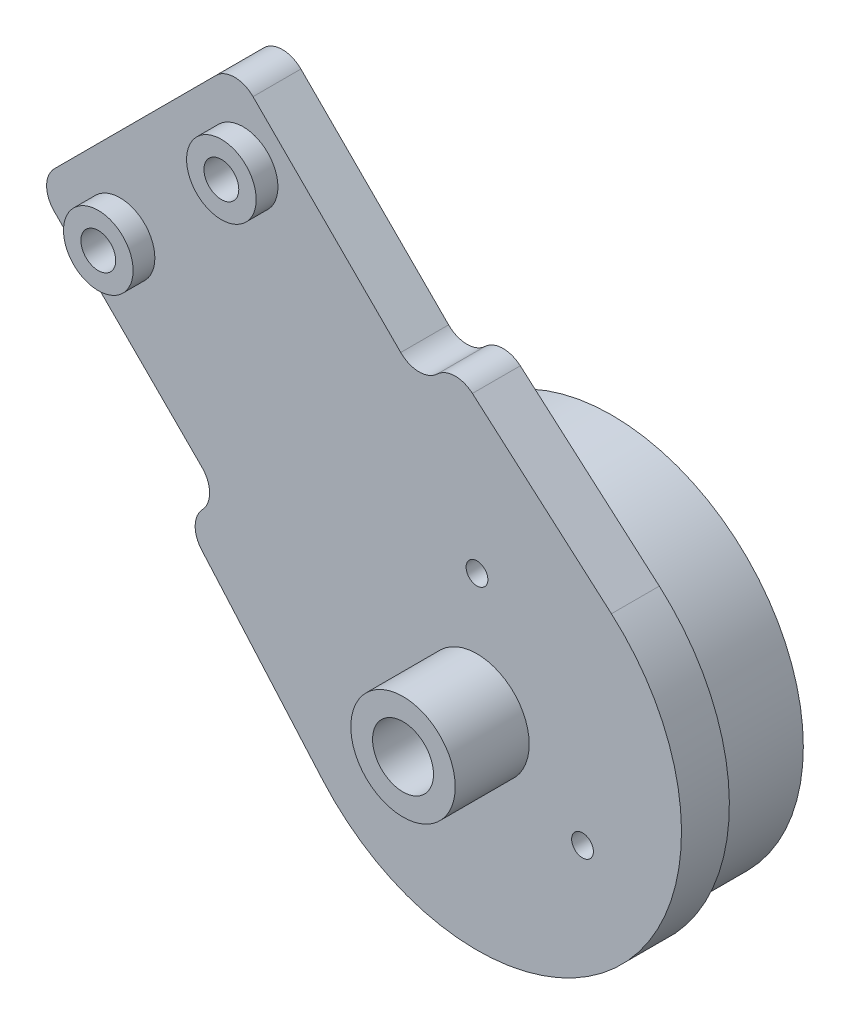
ISO-10303-21;
HEADER;
FILE_DESCRIPTION(('STEP AP214'),'2;1');
FILE_NAME('part.step','',(''),(''),'','','');
FILE_SCHEMA(('AUTOMOTIVE_DESIGN { 1 0 10303 214 1 1 1 1 }'));
ENDSEC;
DATA;
#1=APPLICATION_CONTEXT('core data for automotive mechanical design processes');
#2=APPLICATION_PROTOCOL_DEFINITION('international standard','automotive_design',2000,#1);
#3=PRODUCT_CONTEXT('',#1,'mechanical');
#4=PRODUCT('Part','Part','',(#3));
#5=PRODUCT_RELATED_PRODUCT_CATEGORY('part','',(#4));
#6=PRODUCT_DEFINITION_FORMATION('','',#4);
#7=PRODUCT_DEFINITION_CONTEXT('part definition',#1,'design');
#8=PRODUCT_DEFINITION('design','',#6,#7);
#9=PRODUCT_DEFINITION_SHAPE('','',#8);
#10=(LENGTH_UNIT() NAMED_UNIT(*) SI_UNIT(.MILLI.,.METRE.));
#11=(NAMED_UNIT(*) PLANE_ANGLE_UNIT() SI_UNIT($,.RADIAN.));
#12=(NAMED_UNIT(*) SI_UNIT($,.STERADIAN.) SOLID_ANGLE_UNIT());
#13=UNCERTAINTY_MEASURE_WITH_UNIT(LENGTH_MEASURE(1.E-05),#10,'distance_accuracy_value','');
#14=(GEOMETRIC_REPRESENTATION_CONTEXT(3) GLOBAL_UNCERTAINTY_ASSIGNED_CONTEXT((#13)) GLOBAL_UNIT_ASSIGNED_CONTEXT((#10,
#11,#12)) REPRESENTATION_CONTEXT('',''));
#15=CARTESIAN_POINT('',(0.,0.,0.));
#16=DIRECTION('',(0.,0.,1.));
#17=DIRECTION('',(1.,0.,0.));
#18=AXIS2_PLACEMENT_3D('',#15,#16,#17);
#19=CARTESIAN_POINT('',(93.9692760704438,0.,2.75));
#20=DIRECTION('',(0.,0.,1.));
#21=DIRECTION('',(1.,0.,0.));
#22=AXIS2_PLACEMENT_3D('',#19,#20,#21);
#23=PLANE('',#22);
#24=CARTESIAN_POINT('',(93.9692760704438,7.00000000000001,2.75));
#25=DIRECTION('',(0.,0.,1.));
#26=DIRECTION('',(1.,0.,0.));
#27=AXIS2_PLACEMENT_3D('',#24,#25,#26);
#28=CIRCLE('',#27,0.625000000000006);
#29=CARTESIAN_POINT('',(94.5942760704438,7.00000000000001,2.75));
#30=VERTEX_POINT('',#29);
#31=EDGE_CURVE('E268',#30,#30,#28,.T.);
#32=ORIENTED_EDGE('',*,*,#31,.F.);
#33=EDGE_LOOP('',(#32));
#34=FACE_BOUND('',#33,.T.);
#35=CARTESIAN_POINT('',(100.031453896935,-3.5,2.75));
#36=DIRECTION('',(0.,0.,1.));
#37=DIRECTION('',(1.,0.,0.));
#38=AXIS2_PLACEMENT_3D('',#35,#36,#37);
#39=CIRCLE('',#38,0.62500000000002);
#40=CARTESIAN_POINT('',(100.656453896935,-3.5,2.75));
#41=VERTEX_POINT('',#40);
#42=EDGE_CURVE('E674',#41,#41,#39,.T.);
#43=ORIENTED_EDGE('',*,*,#42,.F.);
#44=EDGE_LOOP('',(#43));
#45=FACE_BOUND('',#44,.T.);
#46=CARTESIAN_POINT('',(87.9070982439527,-3.49999999999999,2.75));
#47=DIRECTION('',(0.,0.,1.));
#48=DIRECTION('',(1.,0.,0.));
#49=AXIS2_PLACEMENT_3D('',#46,#47,#48);
#50=CIRCLE('',#49,0.625000000000005);
#51=CARTESIAN_POINT('',(88.5320982439527,-3.49999999999999,2.75));
#52=VERTEX_POINT('',#51);
#53=EDGE_CURVE('E290',#52,#52,#50,.T.);
#54=ORIENTED_EDGE('',*,*,#53,.F.);
#55=EDGE_LOOP('',(#54));
#56=FACE_BOUND('',#55,.T.);
#57=CARTESIAN_POINT('',(73.4631794160341,13.4350288425446,2.75));
#58=DIRECTION('',(0.,0.,1.));
#59=DIRECTION('',(1.,0.,0.));
#60=AXIS2_PLACEMENT_3D('',#57,#58,#59);
#61=CIRCLE('',#60,2.);
#62=CARTESIAN_POINT('',(75.4631794160341,13.4350288425446,2.75));
#63=VERTEX_POINT('',#62);
#64=EDGE_CURVE('E303',#63,#63,#61,.T.);
#65=ORIENTED_EDGE('',*,*,#64,.F.);
#66=EDGE_LOOP('',(#65));
#67=FACE_BOUND('',#66,.T.);
#68=CARTESIAN_POINT('',(77.1078998940158,3.32035912402747,2.75));
#69=DIRECTION('',(0.,0.,1.));
#70=DIRECTION('',(1.,0.,0.));
#71=AXIS2_PLACEMENT_3D('',#68,#69,#70);
#72=CIRCLE('',#71,1.5);
#73=CARTESIAN_POINT('',(78.1685600657956,4.38101929580729,2.75));
#74=VERTEX_POINT('',#73);
#75=CARTESIAN_POINT('',(78.1926170514238,2.28431439119752,2.75));
#76=VERTEX_POINT('',#75);
#77=EDGE_CURVE('E242',#74,#76,#72,.F.);
#78=ORIENTED_EDGE('',*,*,#77,.T.);
#79=CARTESIAN_POINT('',(79.2773342088318,1.24826965836757,2.75));
#80=DIRECTION('',(0.,0.,1.));
#81=DIRECTION('',(1.,0.,0.));
#82=AXIS2_PLACEMENT_3D('',#79,#80,#81);
#83=CIRCLE('',#82,1.5);
#84=CARTESIAN_POINT('',(78.1470568484111,0.262129156957937,2.75));
#85=VERTEX_POINT('',#84);
#86=EDGE_CURVE('E138',#76,#85,#83,.T.);
#87=ORIENTED_EDGE('',*,*,#86,.T.);
#88=DIRECTION('',(0.657427000939755,-0.753518240280459,0.));
#89=VECTOR('',#88,1.);
#90=CARTESIAN_POINT('',(77.2263127358713,1.31745162232339,2.75));
#91=LINE('',#90,#89);
#92=CARTESIAN_POINT('',(85.1154367471484,-7.7247672610421,2.75));
#93=VERTEX_POINT('',#92);
#94=EDGE_CURVE('E130',#85,#93,#91,.T.);
#95=ORIENTED_EDGE('',*,*,#94,.T.);
#96=CARTESIAN_POINT('',(93.9692760704438,0.,2.75));
#97=DIRECTION('',(0.,0.,1.));
#98=DIRECTION('',(1.,0.,0.));
#99=AXIS2_PLACEMENT_3D('',#96,#97,#98);
#100=CIRCLE('',#99,11.75);
#101=CARTESIAN_POINT('',(101.694043331486,8.85383932329536,2.75));
#102=VERTEX_POINT('',#101);
#103=EDGE_CURVE('E135',#93,#102,#100,.T.);
#104=ORIENTED_EDGE('',*,*,#103,.T.);
#105=DIRECTION('',(-0.753518240280456,0.657427000939758,0.));
#106=VECTOR('',#105,1.);
#107=CARTESIAN_POINT('',(92.6518244481205,16.7429633345725,2.75));
#108=LINE('',#107,#106);
#109=CARTESIAN_POINT('',(93.7071469134859,15.8222192220327,2.75));
#110=VERTEX_POINT('',#109);
#111=EDGE_CURVE('E159',#102,#110,#108,.T.);
#112=ORIENTED_EDGE('',*,*,#111,.T.);
#113=CARTESIAN_POINT('',(92.7210064120763,14.691941861612,2.75));
#114=DIRECTION('',(0.,0.,1.));
#115=DIRECTION('',(1.,0.,0.));
#116=AXIS2_PLACEMENT_3D('',#113,#114,#115);
#117=CIRCLE('',#116,1.5);
#118=CARTESIAN_POINT('',(91.6849616792463,15.77665901902,2.75));
#119=VERTEX_POINT('',#118);
#120=EDGE_CURVE('E58',#110,#119,#117,.T.);
#121=ORIENTED_EDGE('',*,*,#120,.T.);
#122=CARTESIAN_POINT('',(90.6489169464164,16.861376176428,2.75));
#123=DIRECTION('',(0.,0.,1.));
#124=DIRECTION('',(1.,0.,0.));
#125=AXIS2_PLACEMENT_3D('',#122,#123,#124);
#126=CIRCLE('',#125,1.5);
#127=CARTESIAN_POINT('',(89.5882567746365,15.8007160046482,2.75));
#128=VERTEX_POINT('',#127);
#129=EDGE_CURVE('E236',#119,#128,#126,.F.);
#130=ORIENTED_EDGE('',*,*,#129,.T.);
#131=DIRECTION('',(-0.707106781186545,0.70710678118655,0.));
#132=VECTOR('',#131,1.);
#133=CARTESIAN_POINT('',(80.0423152286182,25.3466575506666,2.75));
#134=LINE('',#133,#132);
#135=CARTESIAN_POINT('',(81.102975400398,24.2859973788868,2.75));
#136=VERTEX_POINT('',#135);
#137=EDGE_CURVE('E162',#128,#136,#134,.T.);
#138=ORIENTED_EDGE('',*,*,#137,.T.);
#139=CARTESIAN_POINT('',(80.0423152286182,23.225337207107,2.75));
#140=DIRECTION('',(0.,0.,1.));
#141=DIRECTION('',(1.,0.,0.));
#142=AXIS2_PLACEMENT_3D('',#139,#140,#141);
#143=CIRCLE('',#142,1.5);
#144=CARTESIAN_POINT('',(78.9816550568383,24.2859973788868,2.75));
#145=VERTEX_POINT('',#144);
#146=EDGE_CURVE('E226',#136,#145,#143,.T.);
#147=ORIENTED_EDGE('',*,*,#146,.T.);
#148=DIRECTION('',(-0.707106781186549,-0.707106781186546,0.));
#149=VECTOR('',#148,1.);
#150=CARTESIAN_POINT('',(80.0423152286182,25.3466575506666,2.75));
#151=LINE('',#150,#149);
#152=CARTESIAN_POINT('',(69.683278691557,14.9876210136055,2.75));
#153=VERTEX_POINT('',#152);
#154=EDGE_CURVE('E169',#145,#153,#151,.T.);
#155=ORIENTED_EDGE('',*,*,#154,.T.);
#156=CARTESIAN_POINT('',(70.7439388633368,13.9269608418257,2.75));
#157=DIRECTION('',(0.,0.,1.));
#158=DIRECTION('',(1.,0.,0.));
#159=AXIS2_PLACEMENT_3D('',#156,#157,#158);
#160=CIRCLE('',#159,1.5);
#161=CARTESIAN_POINT('',(69.683278691557,12.8663006700459,2.75));
#162=VERTEX_POINT('',#161);
#163=EDGE_CURVE('E229',#153,#162,#160,.T.);
#164=ORIENTED_EDGE('',*,*,#163,.T.);
#165=DIRECTION('',(0.707106781186547,-0.707106781186548,0.));
#166=VECTOR('',#165,1.);
#167=CARTESIAN_POINT('',(68.6226185197772,13.9269608418257,2.75));
#168=LINE('',#167,#166);
#169=EDGE_CURVE('E143',#162,#74,#168,.T.);
#170=ORIENTED_EDGE('',*,*,#169,.T.);
#171=EDGE_LOOP('',(#78,#87,#95,#104,#112,#121,#130,#138,#147,#155,#164,#170));
#172=FACE_BOUND('',#171,.T.);
#173=CARTESIAN_POINT('',(80.5342472278995,20.50609665441,2.75));
#174=DIRECTION('',(0.,0.,1.));
#175=DIRECTION('',(1.,0.,0.));
#176=AXIS2_PLACEMENT_3D('',#173,#174,#175);
#177=CIRCLE('',#176,2.);
#178=CARTESIAN_POINT('',(82.5342472278995,20.50609665441,2.75));
#179=VERTEX_POINT('',#178);
#180=EDGE_CURVE('E315',#179,#179,#177,.T.);
#181=ORIENTED_EDGE('',*,*,#180,.F.);
#182=EDGE_LOOP('',(#181));
#183=FACE_BOUND('',#182,.T.);
#184=CARTESIAN_POINT('',(93.9692760704438,0.,2.75));
#185=DIRECTION('',(0.,0.,1.));
#186=DIRECTION('',(1.,0.,0.));
#187=AXIS2_PLACEMENT_3D('',#184,#185,#186);
#188=CIRCLE('',#187,3.00000000000001);
#189=CARTESIAN_POINT('',(96.9692760704438,0.,2.75));
#190=VERTEX_POINT('',#189);
#191=EDGE_CURVE('E280',#190,#190,#188,.T.);
#192=ORIENTED_EDGE('',*,*,#191,.F.);
#193=EDGE_LOOP('',(#192));
#194=FACE_BOUND('',#193,.T.);
#195=ADVANCED_FACE('F40',(#34,#45,#56,#67,#172,#183,#194),#23,.T.);
#196=CARTESIAN_POINT('',(93.9692760704438,0.,0.));
#197=DIRECTION('',(0.,0.,1.));
#198=DIRECTION('',(1.,0.,0.));
#199=AXIS2_PLACEMENT_3D('',#196,#197,#198);
#200=PLANE('',#199);
#201=CARTESIAN_POINT('',(73.4631794160341,13.4350288425446,0.));
#202=DIRECTION('',(0.,0.,1.));
#203=DIRECTION('',(1.,0.,0.));
#204=AXIS2_PLACEMENT_3D('',#201,#202,#203);
#205=CIRCLE('',#204,0.999999999999998);
#206=CARTESIAN_POINT('',(74.4631794160341,13.4350288425446,0.));
#207=VERTEX_POINT('',#206);
#208=EDGE_CURVE('E335',#207,#207,#205,.T.);
#209=ORIENTED_EDGE('',*,*,#208,.T.);
#210=EDGE_LOOP('',(#209));
#211=FACE_BOUND('',#210,.T.);
#212=CARTESIAN_POINT('',(80.5342472278995,20.50609665441,0.));
#213=DIRECTION('',(0.,0.,1.));
#214=DIRECTION('',(1.,0.,0.));
#215=AXIS2_PLACEMENT_3D('',#212,#213,#214);
#216=CIRCLE('',#215,0.999999999999998);
#217=CARTESIAN_POINT('',(81.5342472278995,20.50609665441,0.));
#218=VERTEX_POINT('',#217);
#219=EDGE_CURVE('E177',#218,#218,#216,.T.);
#220=ORIENTED_EDGE('',*,*,#219,.T.);
#221=EDGE_LOOP('',(#220));
#222=FACE_BOUND('',#221,.T.);
#223=DIRECTION('',(0.657427000939755,-0.753518240280459,0.));
#224=VECTOR('',#223,1.);
#225=CARTESIAN_POINT('',(77.2263127358713,1.31745162232339,0.));
#226=LINE('',#225,#224);
#227=CARTESIAN_POINT('',(78.1470568484111,0.262129156957937,0.));
#228=VERTEX_POINT('',#227);
#229=CARTESIAN_POINT('',(85.1154367471484,-7.7247672610421,0.));
#230=VERTEX_POINT('',#229);
#231=EDGE_CURVE('E149',#228,#230,#226,.T.);
#232=ORIENTED_EDGE('',*,*,#231,.F.);
#233=CARTESIAN_POINT('',(79.2773342088318,1.24826965836757,0.));
#234=DIRECTION('',(0.,0.,1.));
#235=DIRECTION('',(1.,0.,0.));
#236=AXIS2_PLACEMENT_3D('',#233,#234,#235);
#237=CIRCLE('',#236,1.5);
#238=CARTESIAN_POINT('',(78.1926170514238,2.28431439119752,0.));
#239=VERTEX_POINT('',#238);
#240=EDGE_CURVE('E251',#228,#239,#237,.F.);
#241=ORIENTED_EDGE('',*,*,#240,.T.);
#242=CARTESIAN_POINT('',(77.1078998940158,3.32035912402747,0.));
#243=DIRECTION('',(0.,0.,1.));
#244=DIRECTION('',(1.,0.,0.));
#245=AXIS2_PLACEMENT_3D('',#242,#243,#244);
#246=CIRCLE('',#245,1.5);
#247=CARTESIAN_POINT('',(78.1685600657956,4.38101929580729,0.));
#248=VERTEX_POINT('',#247);
#249=EDGE_CURVE('E239',#239,#248,#246,.T.);
#250=ORIENTED_EDGE('',*,*,#249,.T.);
#251=DIRECTION('',(0.707106781186547,-0.707106781186548,0.));
#252=VECTOR('',#251,1.);
#253=CARTESIAN_POINT('',(68.6226185197772,13.9269608418257,0.));
#254=LINE('',#253,#252);
#255=CARTESIAN_POINT('',(69.683278691557,12.8663006700459,0.));
#256=VERTEX_POINT('',#255);
#257=EDGE_CURVE('E173',#256,#248,#254,.T.);
#258=ORIENTED_EDGE('',*,*,#257,.F.);
#259=CARTESIAN_POINT('',(70.7439388633368,13.9269608418257,0.));
#260=DIRECTION('',(0.,0.,1.));
#261=DIRECTION('',(1.,0.,0.));
#262=AXIS2_PLACEMENT_3D('',#259,#260,#261);
#263=CIRCLE('',#262,1.5);
#264=CARTESIAN_POINT('',(69.683278691557,14.9876210136055,0.));
#265=VERTEX_POINT('',#264);
#266=EDGE_CURVE('E216',#256,#265,#263,.F.);
#267=ORIENTED_EDGE('',*,*,#266,.T.);
#268=DIRECTION('',(-0.707106781186549,-0.707106781186546,0.));
#269=VECTOR('',#268,1.);
#270=CARTESIAN_POINT('',(80.0423152286182,25.3466575506666,0.));
#271=LINE('',#270,#269);
#272=CARTESIAN_POINT('',(78.9816550568383,24.2859973788868,0.));
#273=VERTEX_POINT('',#272);
#274=EDGE_CURVE('E190',#273,#265,#271,.T.);
#275=ORIENTED_EDGE('',*,*,#274,.F.);
#276=CARTESIAN_POINT('',(80.0423152286182,23.225337207107,0.));
#277=DIRECTION('',(0.,0.,1.));
#278=DIRECTION('',(1.,0.,0.));
#279=AXIS2_PLACEMENT_3D('',#276,#277,#278);
#280=CIRCLE('',#279,1.5);
#281=CARTESIAN_POINT('',(81.102975400398,24.2859973788868,0.));
#282=VERTEX_POINT('',#281);
#283=EDGE_CURVE('E213',#273,#282,#280,.F.);
#284=ORIENTED_EDGE('',*,*,#283,.T.);
#285=DIRECTION('',(-0.707106781186545,0.70710678118655,0.));
#286=VECTOR('',#285,1.);
#287=CARTESIAN_POINT('',(80.0423152286182,25.3466575506666,0.));
#288=LINE('',#287,#286);
#289=CARTESIAN_POINT('',(89.5882567746365,15.8007160046482,0.));
#290=VERTEX_POINT('',#289);
#291=EDGE_CURVE('E186',#290,#282,#288,.T.);
#292=ORIENTED_EDGE('',*,*,#291,.F.);
#293=CARTESIAN_POINT('',(90.6489169464164,16.861376176428,0.));
#294=DIRECTION('',(0.,0.,1.));
#295=DIRECTION('',(1.,0.,0.));
#296=AXIS2_PLACEMENT_3D('',#293,#294,#295);
#297=CIRCLE('',#296,1.5);
#298=CARTESIAN_POINT('',(91.6849616792463,15.77665901902,0.));
#299=VERTEX_POINT('',#298);
#300=EDGE_CURVE('E232',#290,#299,#297,.T.);
#301=ORIENTED_EDGE('',*,*,#300,.T.);
#302=CARTESIAN_POINT('',(92.7210064120763,14.691941861612,0.));
#303=DIRECTION('',(0.,0.,1.));
#304=DIRECTION('',(1.,0.,0.));
#305=AXIS2_PLACEMENT_3D('',#302,#303,#304);
#306=CIRCLE('',#305,1.5);
#307=CARTESIAN_POINT('',(93.7071469134859,15.8222192220327,0.));
#308=VERTEX_POINT('',#307);
#309=EDGE_CURVE('E248',#299,#308,#306,.F.);
#310=ORIENTED_EDGE('',*,*,#309,.T.);
#311=DIRECTION('',(-0.753518240280456,0.657427000939758,0.));
#312=VECTOR('',#311,1.);
#313=CARTESIAN_POINT('',(92.6518244481205,16.7429633345725,0.));
#314=LINE('',#313,#312);
#315=CARTESIAN_POINT('',(101.694043331486,8.85383932329536,0.));
#316=VERTEX_POINT('',#315);
#317=EDGE_CURVE('E183',#316,#308,#314,.T.);
#318=ORIENTED_EDGE('',*,*,#317,.F.);
#319=CARTESIAN_POINT('',(93.9692760704438,0.,0.));
#320=DIRECTION('',(0.,0.,1.));
#321=DIRECTION('',(1.,0.,0.));
#322=AXIS2_PLACEMENT_3D('',#319,#320,#321);
#323=CIRCLE('',#322,11.75);
#324=EDGE_CURVE('E180',#230,#316,#323,.T.);
#325=ORIENTED_EDGE('',*,*,#324,.F.);
#326=EDGE_LOOP('',(#232,#241,#250,#258,#267,#275,#284,#292,#301,#310,#318,#325));
#327=FACE_BOUND('',#326,.T.);
#328=CARTESIAN_POINT('',(93.9692760704438,0.,0.));
#329=DIRECTION('',(0.,0.,1.));
#330=DIRECTION('',(1.,0.,0.));
#331=AXIS2_PLACEMENT_3D('',#328,#329,#330);
#332=CIRCLE('',#331,11.);
#333=CARTESIAN_POINT('',(104.969276070444,0.,0.));
#334=VERTEX_POINT('',#333);
#335=EDGE_CURVE('E153',#334,#334,#332,.F.);
#336=ORIENTED_EDGE('',*,*,#335,.F.);
#337=EDGE_LOOP('',(#336));
#338=FACE_BOUND('',#337,.T.);
#339=ADVANCED_FACE('F356',(#211,#222,#327,#338),#200,.F.);
#340=CARTESIAN_POINT('',(68.6226185197772,13.9269608418257,2.75));
#341=DIRECTION('',(0.707106781186548,0.707106781186547,0.));
#342=DIRECTION('',(-0.707106781186547,0.707106781186548,0.));
#343=AXIS2_PLACEMENT_3D('',#340,#341,#342);
#344=PLANE('',#343);
#345=ORIENTED_EDGE('',*,*,#257,.T.);
#346=DIRECTION('',(0.,0.,-1.));
#347=VECTOR('',#346,1.);
#348=CARTESIAN_POINT('',(78.1685600657956,4.38101929580729,2.75));
#349=LINE('',#348,#347);
#350=EDGE_CURVE('E210',#248,#74,#349,.F.);
#351=ORIENTED_EDGE('',*,*,#350,.T.);
#352=ORIENTED_EDGE('',*,*,#169,.F.);
#353=DIRECTION('',(0.,0.,-1.));
#354=VECTOR('',#353,1.);
#355=CARTESIAN_POINT('',(69.683278691557,12.8663006700459,2.75));
#356=LINE('',#355,#354);
#357=EDGE_CURVE('E206',#162,#256,#356,.T.);
#358=ORIENTED_EDGE('',*,*,#357,.T.);
#359=EDGE_LOOP('',(#345,#351,#352,#358));
#360=FACE_BOUND('',#359,.T.);
#361=ADVANCED_FACE('F382',(#360),#344,.F.);
#362=CARTESIAN_POINT('',(77.2263127358713,1.31745162232339,2.75));
#363=DIRECTION('',(0.753518240280459,0.657427000939755,0.));
#364=DIRECTION('',(-0.657427000939755,0.753518240280459,0.));
#365=AXIS2_PLACEMENT_3D('',#362,#363,#364);
#366=PLANE('',#365);
#367=ORIENTED_EDGE('',*,*,#94,.F.);
#368=DIRECTION('',(0.,0.,1.));
#369=VECTOR('',#368,1.);
#370=CARTESIAN_POINT('',(78.1470568484111,0.262129156957936,2.75));
#371=LINE('',#370,#369);
#372=EDGE_CURVE('E245',#85,#228,#371,.F.);
#373=ORIENTED_EDGE('',*,*,#372,.T.);
#374=ORIENTED_EDGE('',*,*,#231,.T.);
#375=DIRECTION('',(0.,0.,-1.));
#376=VECTOR('',#375,1.);
#377=CARTESIAN_POINT('',(85.1154367471484,-7.7247672610421,2.75));
#378=LINE('',#377,#376);
#379=EDGE_CURVE('E146',#93,#230,#378,.T.);
#380=ORIENTED_EDGE('',*,*,#379,.F.);
#381=EDGE_LOOP('',(#367,#373,#374,#380));
#382=FACE_BOUND('',#381,.T.);
#383=ADVANCED_FACE('F147',(#382),#366,.F.);
#384=CARTESIAN_POINT('',(93.9692760704438,0.,2.75));
#385=DIRECTION('',(0.,0.,-1.));
#386=DIRECTION('',(-1.,0.,0.));
#387=AXIS2_PLACEMENT_3D('',#384,#385,#386);
#388=CYLINDRICAL_SURFACE('',#387,11.75);
#389=ORIENTED_EDGE('',*,*,#324,.T.);
#390=DIRECTION('',(0.,0.,-1.));
#391=VECTOR('',#390,1.);
#392=CARTESIAN_POINT('',(101.694043331486,8.85383932329536,2.75));
#393=LINE('',#392,#391);
#394=EDGE_CURVE('E154',#102,#316,#393,.T.);
#395=ORIENTED_EDGE('',*,*,#394,.F.);
#396=ORIENTED_EDGE('',*,*,#103,.F.);
#397=ORIENTED_EDGE('',*,*,#379,.T.);
#398=EDGE_LOOP('',(#389,#395,#396,#397));
#399=FACE_BOUND('',#398,.T.);
#400=ADVANCED_FACE('F156',(#399),#388,.T.);
#401=CARTESIAN_POINT('',(92.6518244481205,16.7429633345725,2.75));
#402=DIRECTION('',(-0.657427000939758,-0.753518240280456,0.));
#403=DIRECTION('',(0.753518240280456,-0.657427000939758,0.));
#404=AXIS2_PLACEMENT_3D('',#401,#402,#403);
#405=PLANE('',#404);
#406=ORIENTED_EDGE('',*,*,#317,.T.);
#407=DIRECTION('',(0.,0.,1.));
#408=VECTOR('',#407,1.);
#409=CARTESIAN_POINT('',(93.7071469134859,15.8222192220327,2.75));
#410=LINE('',#409,#408);
#411=EDGE_CURVE('E11',#308,#110,#410,.T.);
#412=ORIENTED_EDGE('',*,*,#411,.T.);
#413=ORIENTED_EDGE('',*,*,#111,.F.);
#414=ORIENTED_EDGE('',*,*,#394,.T.);
#415=EDGE_LOOP('',(#406,#412,#413,#414));
#416=FACE_BOUND('',#415,.T.);
#417=ADVANCED_FACE('F359',(#416),#405,.F.);
#418=CARTESIAN_POINT('',(80.0423152286182,25.3466575506666,2.75));
#419=DIRECTION('',(-0.70710678118655,-0.707106781186545,0.));
#420=DIRECTION('',(0.707106781186545,-0.70710678118655,0.));
#421=AXIS2_PLACEMENT_3D('',#418,#419,#420);
#422=PLANE('',#421);
#423=ORIENTED_EDGE('',*,*,#137,.F.);
#424=DIRECTION('',(0.,0.,-1.));
#425=VECTOR('',#424,1.);
#426=CARTESIAN_POINT('',(89.5882567746365,15.8007160046482,0.));
#427=LINE('',#426,#425);
#428=EDGE_CURVE('E202',#128,#290,#427,.T.);
#429=ORIENTED_EDGE('',*,*,#428,.T.);
#430=ORIENTED_EDGE('',*,*,#291,.T.);
#431=DIRECTION('',(0.,0.,-1.));
#432=VECTOR('',#431,1.);
#433=CARTESIAN_POINT('',(81.102975400398,24.2859973788868,2.75));
#434=LINE('',#433,#432);
#435=EDGE_CURVE('E199',#282,#136,#434,.F.);
#436=ORIENTED_EDGE('',*,*,#435,.T.);
#437=EDGE_LOOP('',(#423,#429,#430,#436));
#438=FACE_BOUND('',#437,.T.);
#439=ADVANCED_FACE('F370',(#438),#422,.F.);
#440=CARTESIAN_POINT('',(80.0423152286182,25.3466575506666,2.75));
#441=DIRECTION('',(0.707106781186546,-0.707106781186549,0.));
#442=DIRECTION('',(0.707106781186549,0.707106781186546,0.));
#443=AXIS2_PLACEMENT_3D('',#440,#441,#442);
#444=PLANE('',#443);
#445=ORIENTED_EDGE('',*,*,#274,.T.);
#446=DIRECTION('',(0.,0.,-1.));
#447=VECTOR('',#446,1.);
#448=CARTESIAN_POINT('',(69.683278691557,14.9876210136055,2.75));
#449=LINE('',#448,#447);
#450=EDGE_CURVE('E223',#265,#153,#449,.F.);
#451=ORIENTED_EDGE('',*,*,#450,.T.);
#452=ORIENTED_EDGE('',*,*,#154,.F.);
#453=DIRECTION('',(0.,0.,-1.));
#454=VECTOR('',#453,1.);
#455=CARTESIAN_POINT('',(78.9816550568383,24.2859973788868,2.75));
#456=LINE('',#455,#454);
#457=EDGE_CURVE('E219',#145,#273,#456,.T.);
#458=ORIENTED_EDGE('',*,*,#457,.T.);
#459=EDGE_LOOP('',(#445,#451,#452,#458));
#460=FACE_BOUND('',#459,.T.);
#461=ADVANCED_FACE('F377',(#460),#444,.F.);
#462=CARTESIAN_POINT('',(80.5342472278995,20.50609665441,2.75));
#463=DIRECTION('',(0.,0.,-1.));
#464=DIRECTION('',(-1.,0.,0.));
#465=AXIS2_PLACEMENT_3D('',#462,#463,#464);
#466=CYLINDRICAL_SURFACE('',#465,0.999999999999998);
#467=ORIENTED_EDGE('',*,*,#219,.F.);
#468=EDGE_LOOP('',(#467));
#469=FACE_BOUND('',#468,.T.);
#470=CARTESIAN_POINT('',(80.5342472278995,20.50609665441,4.));
#471=DIRECTION('',(0.,0.,1.));
#472=DIRECTION('',(1.,0.,0.));
#473=AXIS2_PLACEMENT_3D('',#470,#471,#472);
#474=CIRCLE('',#473,0.999999999999998);
#475=CARTESIAN_POINT('',(81.5342472278995,20.50609665441,4.));
#476=VERTEX_POINT('',#475);
#477=EDGE_CURVE('E308',#476,#476,#474,.T.);
#478=ORIENTED_EDGE('',*,*,#477,.T.);
#479=EDGE_LOOP('',(#478));
#480=FACE_BOUND('',#479,.T.);
#481=ADVANCED_FACE('F406',(#469,#480),#466,.F.);
#482=CARTESIAN_POINT('',(73.4631794160341,13.4350288425446,2.75));
#483=DIRECTION('',(0.,0.,-1.));
#484=DIRECTION('',(-1.,0.,0.));
#485=AXIS2_PLACEMENT_3D('',#482,#483,#484);
#486=CYLINDRICAL_SURFACE('',#485,0.999999999999998);
#487=ORIENTED_EDGE('',*,*,#208,.F.);
#488=EDGE_LOOP('',(#487));
#489=FACE_BOUND('',#488,.T.);
#490=CARTESIAN_POINT('',(73.4631794160341,13.4350288425446,4.));
#491=DIRECTION('',(0.,0.,1.));
#492=DIRECTION('',(1.,0.,0.));
#493=AXIS2_PLACEMENT_3D('',#490,#491,#492);
#494=CIRCLE('',#493,0.999999999999998);
#495=CARTESIAN_POINT('',(74.4631794160341,13.4350288425446,4.));
#496=VERTEX_POINT('',#495);
#497=EDGE_CURVE('E299',#496,#496,#494,.T.);
#498=ORIENTED_EDGE('',*,*,#497,.T.);
#499=EDGE_LOOP('',(#498));
#500=FACE_BOUND('',#499,.T.);
#501=ADVANCED_FACE('F437',(#489,#500),#486,.F.);
#502=CARTESIAN_POINT('',(93.9692760704438,0.,-5.));
#503=DIRECTION('',(0.,0.,-1.));
#504=DIRECTION('',(-1.,0.,0.));
#505=AXIS2_PLACEMENT_3D('',#502,#503,#504);
#506=PLANE('',#505);
#507=CARTESIAN_POINT('',(93.9692760704438,0.,-5.));
#508=DIRECTION('',(0.,0.,-1.));
#509=DIRECTION('',(-1.,0.,0.));
#510=AXIS2_PLACEMENT_3D('',#507,#508,#509);
#511=CIRCLE('',#510,11.);
#512=CARTESIAN_POINT('',(82.9692760704438,0.,-5.));
#513=VERTEX_POINT('',#512);
#514=EDGE_CURVE('E327',#513,#513,#511,.T.);
#515=ORIENTED_EDGE('',*,*,#514,.T.);
#516=EDGE_LOOP('',(#515));
#517=FACE_BOUND('',#516,.T.);
#518=CARTESIAN_POINT('',(93.9692760704438,0.,-5.));
#519=DIRECTION('',(0.,0.,-1.));
#520=DIRECTION('',(-1.,0.,0.));
#521=AXIS2_PLACEMENT_3D('',#518,#519,#520);
#522=CIRCLE('',#521,9.99999999999999);
#523=CARTESIAN_POINT('',(83.9692760704438,0.,-5.));
#524=VERTEX_POINT('',#523);
#525=EDGE_CURVE('E320',#524,#524,#522,.T.);
#526=ORIENTED_EDGE('',*,*,#525,.F.);
#527=EDGE_LOOP('',(#526));
#528=FACE_BOUND('',#527,.T.);
#529=ADVANCED_FACE('F445',(#517,#528),#506,.T.);
#530=CARTESIAN_POINT('',(93.9692760704438,0.,-5.));
#531=DIRECTION('',(0.,0.,1.));
#532=DIRECTION('',(1.,0.,0.));
#533=AXIS2_PLACEMENT_3D('',#530,#531,#532);
#534=CYLINDRICAL_SURFACE('',#533,11.);
#535=ORIENTED_EDGE('',*,*,#514,.F.);
#536=EDGE_LOOP('',(#535));
#537=FACE_BOUND('',#536,.T.);
#538=ORIENTED_EDGE('',*,*,#335,.T.);
#539=EDGE_LOOP('',(#538));
#540=FACE_BOUND('',#539,.T.);
#541=ADVANCED_FACE('F453',(#537,#540),#534,.T.);
#542=CARTESIAN_POINT('',(93.9692760704438,0.,1.75));
#543=DIRECTION('',(0.,0.,1.));
#544=DIRECTION('',(1.,0.,0.));
#545=AXIS2_PLACEMENT_3D('',#542,#543,#544);
#546=PLANE('',#545);
#547=CARTESIAN_POINT('',(93.9692760704438,7.00000000000001,1.75));
#548=DIRECTION('',(0.,0.,1.));
#549=DIRECTION('',(1.,0.,0.));
#550=AXIS2_PLACEMENT_3D('',#547,#548,#549);
#551=CIRCLE('',#550,0.625000000000006);
#552=CARTESIAN_POINT('',(94.5942760704438,7.00000000000001,1.75));
#553=VERTEX_POINT('',#552);
#554=EDGE_CURVE('E44',#553,#553,#551,.T.);
#555=ORIENTED_EDGE('',*,*,#554,.T.);
#556=EDGE_LOOP('',(#555));
#557=FACE_BOUND('',#556,.T.);
#558=CARTESIAN_POINT('',(100.031453896935,-3.5,1.75));
#559=DIRECTION('',(0.,0.,1.));
#560=DIRECTION('',(1.,0.,0.));
#561=AXIS2_PLACEMENT_3D('',#558,#559,#560);
#562=CIRCLE('',#561,0.62500000000002);
#563=CARTESIAN_POINT('',(100.656453896935,-3.5,1.75));
#564=VERTEX_POINT('',#563);
#565=EDGE_CURVE('E267',#564,#564,#562,.T.);
#566=ORIENTED_EDGE('',*,*,#565,.T.);
#567=EDGE_LOOP('',(#566));
#568=FACE_BOUND('',#567,.T.);
#569=CARTESIAN_POINT('',(87.9070982439527,-3.49999999999999,1.75));
#570=DIRECTION('',(0.,0.,1.));
#571=DIRECTION('',(1.,0.,0.));
#572=AXIS2_PLACEMENT_3D('',#569,#570,#571);
#573=CIRCLE('',#572,0.625000000000005);
#574=CARTESIAN_POINT('',(88.5320982439527,-3.49999999999999,1.75));
#575=VERTEX_POINT('',#574);
#576=EDGE_CURVE('E264',#575,#575,#573,.T.);
#577=ORIENTED_EDGE('',*,*,#576,.T.);
#578=EDGE_LOOP('',(#577));
#579=FACE_BOUND('',#578,.T.);
#580=CARTESIAN_POINT('',(93.9692760704438,0.,1.75));
#581=DIRECTION('',(0.,0.,1.));
#582=DIRECTION('',(1.,0.,0.));
#583=AXIS2_PLACEMENT_3D('',#580,#581,#582);
#584=CIRCLE('',#583,1.75);
#585=CARTESIAN_POINT('',(95.7192760704438,0.,1.75));
#586=VERTEX_POINT('',#585);
#587=EDGE_CURVE('E294',#586,#586,#584,.F.);
#588=ORIENTED_EDGE('',*,*,#587,.F.);
#589=EDGE_LOOP('',(#588));
#590=FACE_BOUND('',#589,.T.);
#591=CARTESIAN_POINT('',(93.9692760704438,0.,1.75));
#592=DIRECTION('',(0.,0.,1.));
#593=DIRECTION('',(1.,0.,0.));
#594=AXIS2_PLACEMENT_3D('',#591,#592,#593);
#595=CIRCLE('',#594,9.99999999999999);
#596=CARTESIAN_POINT('',(103.969276070444,0.,1.75));
#597=VERTEX_POINT('',#596);
#598=EDGE_CURVE('E331',#597,#597,#595,.T.);
#599=ORIENTED_EDGE('',*,*,#598,.F.);
#600=EDGE_LOOP('',(#599));
#601=FACE_BOUND('',#600,.T.);
#602=ADVANCED_FACE('F461',(#557,#568,#579,#590,#601),#546,.F.);
#603=CARTESIAN_POINT('',(93.9692760704438,0.,2.75));
#604=DIRECTION('',(0.,0.,-1.));
#605=DIRECTION('',(-1.,0.,0.));
#606=AXIS2_PLACEMENT_3D('',#603,#604,#605);
#607=CYLINDRICAL_SURFACE('',#606,9.99999999999999);
#608=ORIENTED_EDGE('',*,*,#598,.T.);
#609=EDGE_LOOP('',(#608));
#610=FACE_BOUND('',#609,.T.);
#611=ORIENTED_EDGE('',*,*,#525,.T.);
#612=EDGE_LOOP('',(#611));
#613=FACE_BOUND('',#612,.T.);
#614=ADVANCED_FACE('F401',(#610,#613),#607,.F.);
#615=CARTESIAN_POINT('',(90.6489169464164,16.861376176428,2.75));
#616=DIRECTION('',(0.,0.,1.));
#617=DIRECTION('',(1.,0.,0.));
#618=AXIS2_PLACEMENT_3D('',#615,#616,#617);
#619=CYLINDRICAL_SURFACE('',#618,1.5);
#620=ORIENTED_EDGE('',*,*,#129,.F.);
#621=DIRECTION('',(0.,0.,1.));
#622=VECTOR('',#621,1.);
#623=CARTESIAN_POINT('',(91.6849616792463,15.77665901902,2.75));
#624=LINE('',#623,#622);
#625=EDGE_CURVE('E50',#119,#299,#624,.F.);
#626=ORIENTED_EDGE('',*,*,#625,.T.);
#627=ORIENTED_EDGE('',*,*,#300,.F.);
#628=ORIENTED_EDGE('',*,*,#428,.F.);
#629=EDGE_LOOP('',(#620,#626,#627,#628));
#630=FACE_BOUND('',#629,.T.);
#631=ADVANCED_FACE('F363',(#630),#619,.F.);
#632=CARTESIAN_POINT('',(77.1078998940158,3.32035912402747,2.75));
#633=DIRECTION('',(0.,0.,1.));
#634=DIRECTION('',(1.,0.,0.));
#635=AXIS2_PLACEMENT_3D('',#632,#633,#634);
#636=CYLINDRICAL_SURFACE('',#635,1.5);
#637=ORIENTED_EDGE('',*,*,#249,.F.);
#638=DIRECTION('',(0.,0.,1.));
#639=VECTOR('',#638,1.);
#640=CARTESIAN_POINT('',(78.1926170514238,2.28431439119752,2.75));
#641=LINE('',#640,#639);
#642=EDGE_CURVE('E254',#239,#76,#641,.T.);
#643=ORIENTED_EDGE('',*,*,#642,.T.);
#644=ORIENTED_EDGE('',*,*,#77,.F.);
#645=ORIENTED_EDGE('',*,*,#350,.F.);
#646=EDGE_LOOP('',(#637,#643,#644,#645));
#647=FACE_BOUND('',#646,.T.);
#648=ADVANCED_FACE('F351',(#647),#636,.F.);
#649=CARTESIAN_POINT('',(70.7439388633368,13.9269608418257,2.75));
#650=DIRECTION('',(0.,0.,-1.));
#651=DIRECTION('',(-1.,0.,0.));
#652=AXIS2_PLACEMENT_3D('',#649,#650,#651);
#653=CYLINDRICAL_SURFACE('',#652,1.5);
#654=ORIENTED_EDGE('',*,*,#163,.F.);
#655=ORIENTED_EDGE('',*,*,#450,.F.);
#656=ORIENTED_EDGE('',*,*,#266,.F.);
#657=ORIENTED_EDGE('',*,*,#357,.F.);
#658=EDGE_LOOP('',(#654,#655,#656,#657));
#659=FACE_BOUND('',#658,.T.);
#660=ADVANCED_FACE('F380',(#659),#653,.T.);
#661=CARTESIAN_POINT('',(80.0423152286182,23.225337207107,2.75));
#662=DIRECTION('',(0.,0.,-1.));
#663=DIRECTION('',(-1.,0.,0.));
#664=AXIS2_PLACEMENT_3D('',#661,#662,#663);
#665=CYLINDRICAL_SURFACE('',#664,1.5);
#666=ORIENTED_EDGE('',*,*,#146,.F.);
#667=ORIENTED_EDGE('',*,*,#435,.F.);
#668=ORIENTED_EDGE('',*,*,#283,.F.);
#669=ORIENTED_EDGE('',*,*,#457,.F.);
#670=EDGE_LOOP('',(#666,#667,#668,#669));
#671=FACE_BOUND('',#670,.T.);
#672=ADVANCED_FACE('F373',(#671),#665,.T.);
#673=CARTESIAN_POINT('',(79.2773342088318,1.24826965836757,2.75));
#674=DIRECTION('',(0.,0.,1.));
#675=DIRECTION('',(1.,0.,0.));
#676=AXIS2_PLACEMENT_3D('',#673,#674,#675);
#677=CYLINDRICAL_SURFACE('',#676,1.5);
#678=ORIENTED_EDGE('',*,*,#86,.F.);
#679=ORIENTED_EDGE('',*,*,#642,.F.);
#680=ORIENTED_EDGE('',*,*,#240,.F.);
#681=ORIENTED_EDGE('',*,*,#372,.F.);
#682=EDGE_LOOP('',(#678,#679,#680,#681));
#683=FACE_BOUND('',#682,.T.);
#684=ADVANCED_FACE('F354',(#683),#677,.T.);
#685=CARTESIAN_POINT('',(92.7210064120763,14.691941861612,2.75));
#686=DIRECTION('',(0.,0.,1.));
#687=DIRECTION('',(1.,0.,0.));
#688=AXIS2_PLACEMENT_3D('',#685,#686,#687);
#689=CYLINDRICAL_SURFACE('',#688,1.5);
#690=ORIENTED_EDGE('',*,*,#120,.F.);
#691=ORIENTED_EDGE('',*,*,#411,.F.);
#692=ORIENTED_EDGE('',*,*,#309,.F.);
#693=ORIENTED_EDGE('',*,*,#625,.F.);
#694=EDGE_LOOP('',(#690,#691,#692,#693));
#695=FACE_BOUND('',#694,.T.);
#696=ADVANCED_FACE('F42',(#695),#689,.T.);
#697=CARTESIAN_POINT('',(80.5342472278995,20.50609665441,4.));
#698=DIRECTION('',(0.,0.,1.));
#699=DIRECTION('',(1.,0.,0.));
#700=AXIS2_PLACEMENT_3D('',#697,#698,#699);
#701=PLANE('',#700);
#702=CARTESIAN_POINT('',(80.5342472278995,20.50609665441,4.));
#703=DIRECTION('',(0.,0.,1.));
#704=DIRECTION('',(1.,0.,0.));
#705=AXIS2_PLACEMENT_3D('',#702,#703,#704);
#706=CIRCLE('',#705,2.);
#707=CARTESIAN_POINT('',(82.5342472278995,20.50609665441,4.));
#708=VERTEX_POINT('',#707);
#709=EDGE_CURVE('E316',#708,#708,#706,.T.);
#710=ORIENTED_EDGE('',*,*,#709,.T.);
#711=EDGE_LOOP('',(#710));
#712=FACE_BOUND('',#711,.T.);
#713=ORIENTED_EDGE('',*,*,#477,.F.);
#714=EDGE_LOOP('',(#713));
#715=FACE_BOUND('',#714,.T.);
#716=ADVANCED_FACE('F508',(#712,#715),#701,.T.);
#717=CARTESIAN_POINT('',(80.5342472278995,20.50609665441,4.));
#718=DIRECTION('',(0.,0.,-1.));
#719=DIRECTION('',(-1.,0.,0.));
#720=AXIS2_PLACEMENT_3D('',#717,#718,#719);
#721=CYLINDRICAL_SURFACE('',#720,2.);
#722=ORIENTED_EDGE('',*,*,#709,.F.);
#723=EDGE_LOOP('',(#722));
#724=FACE_BOUND('',#723,.T.);
#725=ORIENTED_EDGE('',*,*,#180,.T.);
#726=EDGE_LOOP('',(#725));
#727=FACE_BOUND('',#726,.T.);
#728=ADVANCED_FACE('F513',(#724,#727),#721,.T.);
#729=CARTESIAN_POINT('',(73.4631794160341,13.4350288425446,4.));
#730=DIRECTION('',(0.,0.,1.));
#731=DIRECTION('',(1.,0.,0.));
#732=AXIS2_PLACEMENT_3D('',#729,#730,#731);
#733=PLANE('',#732);
#734=CARTESIAN_POINT('',(73.4631794160341,13.4350288425446,4.));
#735=DIRECTION('',(0.,0.,1.));
#736=DIRECTION('',(1.,0.,0.));
#737=AXIS2_PLACEMENT_3D('',#734,#735,#736);
#738=CIRCLE('',#737,2.);
#739=CARTESIAN_POINT('',(75.4631794160341,13.4350288425446,4.));
#740=VERTEX_POINT('',#739);
#741=EDGE_CURVE('E304',#740,#740,#738,.T.);
#742=ORIENTED_EDGE('',*,*,#741,.T.);
#743=EDGE_LOOP('',(#742));
#744=FACE_BOUND('',#743,.T.);
#745=ORIENTED_EDGE('',*,*,#497,.F.);
#746=EDGE_LOOP('',(#745));
#747=FACE_BOUND('',#746,.T.);
#748=ADVANCED_FACE('F521',(#744,#747),#733,.T.);
#749=CARTESIAN_POINT('',(73.4631794160341,13.4350288425446,4.));
#750=DIRECTION('',(0.,0.,-1.));
#751=DIRECTION('',(-1.,0.,0.));
#752=AXIS2_PLACEMENT_3D('',#749,#750,#751);
#753=CYLINDRICAL_SURFACE('',#752,2.);
#754=ORIENTED_EDGE('',*,*,#741,.F.);
#755=EDGE_LOOP('',(#754));
#756=FACE_BOUND('',#755,.T.);
#757=ORIENTED_EDGE('',*,*,#64,.T.);
#758=EDGE_LOOP('',(#757));
#759=FACE_BOUND('',#758,.T.);
#760=ADVANCED_FACE('F529',(#756,#759),#753,.T.);
#761=CARTESIAN_POINT('',(93.9692760704438,0.,-3.19974746830583));
#762=DIRECTION('',(0.,0.,1.));
#763=DIRECTION('',(1.,0.,0.));
#764=AXIS2_PLACEMENT_3D('',#761,#762,#763);
#765=CYLINDRICAL_SURFACE('',#764,1.75);
#766=ORIENTED_EDGE('',*,*,#587,.T.);
#767=EDGE_LOOP('',(#766));
#768=FACE_BOUND('',#767,.T.);
#769=CARTESIAN_POINT('',(93.9692760704438,0.,7.));
#770=DIRECTION('',(0.,0.,1.));
#771=DIRECTION('',(1.,0.,0.));
#772=AXIS2_PLACEMENT_3D('',#769,#770,#771);
#773=CIRCLE('',#772,1.75);
#774=CARTESIAN_POINT('',(95.7192760704438,0.,7.));
#775=VERTEX_POINT('',#774);
#776=EDGE_CURVE('E275',#775,#775,#773,.T.);
#777=ORIENTED_EDGE('',*,*,#776,.T.);
#778=EDGE_LOOP('',(#777));
#779=FACE_BOUND('',#778,.T.);
#780=ADVANCED_FACE('F537',(#768,#779),#765,.F.);
#781=CARTESIAN_POINT('',(93.9692760704438,0.,7.));
#782=DIRECTION('',(0.,0.,1.));
#783=DIRECTION('',(1.,0.,0.));
#784=AXIS2_PLACEMENT_3D('',#781,#782,#783);
#785=PLANE('',#784);
#786=CARTESIAN_POINT('',(93.9692760704438,0.,7.));
#787=DIRECTION('',(0.,0.,1.));
#788=DIRECTION('',(1.,0.,0.));
#789=AXIS2_PLACEMENT_3D('',#786,#787,#788);
#790=CIRCLE('',#789,3.00000000000001);
#791=CARTESIAN_POINT('',(96.9692760704438,0.,7.));
#792=VERTEX_POINT('',#791);
#793=EDGE_CURVE('E286',#792,#792,#790,.T.);
#794=ORIENTED_EDGE('',*,*,#793,.T.);
#795=EDGE_LOOP('',(#794));
#796=FACE_BOUND('',#795,.T.);
#797=ORIENTED_EDGE('',*,*,#776,.F.);
#798=EDGE_LOOP('',(#797));
#799=FACE_BOUND('',#798,.T.);
#800=ADVANCED_FACE('F545',(#796,#799),#785,.T.);
#801=CARTESIAN_POINT('',(93.9692760704438,0.,7.));
#802=DIRECTION('',(0.,0.,-1.));
#803=DIRECTION('',(-1.,0.,0.));
#804=AXIS2_PLACEMENT_3D('',#801,#802,#803);
#805=CYLINDRICAL_SURFACE('',#804,3.00000000000001);
#806=ORIENTED_EDGE('',*,*,#793,.F.);
#807=EDGE_LOOP('',(#806));
#808=FACE_BOUND('',#807,.T.);
#809=ORIENTED_EDGE('',*,*,#191,.T.);
#810=EDGE_LOOP('',(#809));
#811=FACE_BOUND('',#810,.T.);
#812=ADVANCED_FACE('F553',(#808,#811),#805,.T.);
#813=CARTESIAN_POINT('',(87.9070982439527,-3.49999999999999,-1.5));
#814=DIRECTION('',(0.,0.,1.));
#815=DIRECTION('',(1.,0.,0.));
#816=AXIS2_PLACEMENT_3D('',#813,#814,#815);
#817=CYLINDRICAL_SURFACE('',#816,0.625000000000005);
#818=ORIENTED_EDGE('',*,*,#53,.T.);
#819=EDGE_LOOP('',(#818));
#820=FACE_BOUND('',#819,.T.);
#821=ORIENTED_EDGE('',*,*,#576,.F.);
#822=EDGE_LOOP('',(#821));
#823=FACE_BOUND('',#822,.T.);
#824=ADVANCED_FACE('F561',(#820,#823),#817,.F.);
#825=CARTESIAN_POINT('',(100.031453896935,-3.5,-1.5));
#826=DIRECTION('',(0.,0.,1.));
#827=DIRECTION('',(1.,0.,0.));
#828=AXIS2_PLACEMENT_3D('',#825,#826,#827);
#829=CYLINDRICAL_SURFACE('',#828,0.62500000000002);
#830=ORIENTED_EDGE('',*,*,#42,.T.);
#831=EDGE_LOOP('',(#830));
#832=FACE_BOUND('',#831,.T.);
#833=ORIENTED_EDGE('',*,*,#565,.F.);
#834=EDGE_LOOP('',(#833));
#835=FACE_BOUND('',#834,.T.);
#836=ADVANCED_FACE('F568',(#832,#835),#829,.F.);
#837=CARTESIAN_POINT('',(93.9692760704438,7.00000000000001,-1.5));
#838=DIRECTION('',(0.,0.,1.));
#839=DIRECTION('',(1.,0.,0.));
#840=AXIS2_PLACEMENT_3D('',#837,#838,#839);
#841=CYLINDRICAL_SURFACE('',#840,0.625000000000006);
#842=ORIENTED_EDGE('',*,*,#31,.T.);
#843=EDGE_LOOP('',(#842));
#844=FACE_BOUND('',#843,.T.);
#845=ORIENTED_EDGE('',*,*,#554,.F.);
#846=EDGE_LOOP('',(#845));
#847=FACE_BOUND('',#846,.T.);
#848=ADVANCED_FACE('F576',(#844,#847),#841,.F.);
#849=CLOSED_SHELL('',(#195,#339,#361,#383,#400,#417,#439,#461,#481,#501,#529,#541,#602,#614,
#631,#648,#660,#672,#684,#696,#716,#728,#748,#760,#780,#800,#812,#824,#836,#848));
#850=MANIFOLD_SOLID_BREP('B2',#849);
#851=ADVANCED_BREP_SHAPE_REPRESENTATION('',(#18,#850),#14);
#852=SHAPE_DEFINITION_REPRESENTATION(#9,#851);
ENDSEC;
END-ISO-10303-21;
